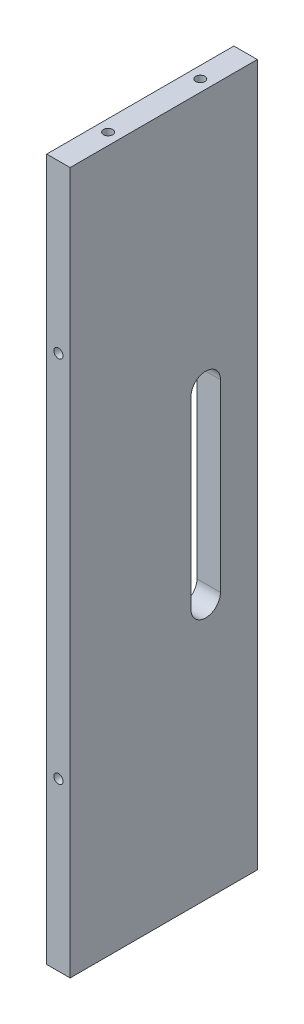
ISO-10303-21;
HEADER;
FILE_DESCRIPTION(('STEP AP214'),'2;1');
FILE_NAME('part.step','',(''),(''),'','','');
FILE_SCHEMA(('AUTOMOTIVE_DESIGN { 1 0 10303 214 1 1 1 1 }'));
ENDSEC;
DATA;
#1=APPLICATION_CONTEXT('core data for automotive mechanical design processes');
#2=APPLICATION_PROTOCOL_DEFINITION('international standard','automotive_design',2000,#1);
#3=PRODUCT_CONTEXT('',#1,'mechanical');
#4=PRODUCT('Part','Part','',(#3));
#5=PRODUCT_RELATED_PRODUCT_CATEGORY('part','',(#4));
#6=PRODUCT_DEFINITION_FORMATION('','',#4);
#7=PRODUCT_DEFINITION_CONTEXT('part definition',#1,'design');
#8=PRODUCT_DEFINITION('design','',#6,#7);
#9=PRODUCT_DEFINITION_SHAPE('','',#8);
#10=(LENGTH_UNIT() NAMED_UNIT(*) SI_UNIT(.MILLI.,.METRE.));
#11=(NAMED_UNIT(*) PLANE_ANGLE_UNIT() SI_UNIT($,.RADIAN.));
#12=(NAMED_UNIT(*) SI_UNIT($,.STERADIAN.) SOLID_ANGLE_UNIT());
#13=UNCERTAINTY_MEASURE_WITH_UNIT(LENGTH_MEASURE(1.E-05),#10,'distance_accuracy_value','');
#14=(GEOMETRIC_REPRESENTATION_CONTEXT(3) GLOBAL_UNCERTAINTY_ASSIGNED_CONTEXT((#13)) GLOBAL_UNIT_ASSIGNED_CONTEXT((#10,
#11,#12)) REPRESENTATION_CONTEXT('',''));
#15=CARTESIAN_POINT('',(0.,0.,0.));
#16=DIRECTION('',(0.,0.,1.));
#17=DIRECTION('',(1.,0.,0.));
#18=AXIS2_PLACEMENT_3D('',#15,#16,#17);
#19=CARTESIAN_POINT('',(-133.35,0.,0.));
#20=DIRECTION('',(1.,0.,0.));
#21=DIRECTION('',(0.,0.,-1.));
#22=AXIS2_PLACEMENT_3D('',#19,#20,#21);
#23=PLANE('',#22);
#24=DIRECTION('',(0.,1.,0.));
#25=VECTOR('',#24,1.);
#26=CARTESIAN_POINT('',(-133.35,-95.25,12.7));
#27=LINE('',#26,#25);
#28=CARTESIAN_POINT('',(-133.35,-95.25,12.7));
#29=VERTEX_POINT('',#28);
#30=CARTESIAN_POINT('',(-133.35,95.25,12.7));
#31=VERTEX_POINT('',#30);
#32=EDGE_CURVE('E222',#29,#31,#27,.T.);
#33=ORIENTED_EDGE('',*,*,#32,.T.);
#34=DIRECTION('',(0.,0.,1.));
#35=VECTOR('',#34,1.);
#36=CARTESIAN_POINT('',(-133.35,95.25,12.7));
#37=LINE('',#36,#35);
#38=CARTESIAN_POINT('',(-133.35,95.25,63.5));
#39=VERTEX_POINT('',#38);
#40=EDGE_CURVE('E227',#31,#39,#37,.T.);
#41=ORIENTED_EDGE('',*,*,#40,.T.);
#42=DIRECTION('',(0.,-1.,0.));
#43=VECTOR('',#42,1.);
#44=CARTESIAN_POINT('',(-133.35,-95.25,63.5));
#45=LINE('',#44,#43);
#46=CARTESIAN_POINT('',(-133.35,-95.25,63.5));
#47=VERTEX_POINT('',#46);
#48=EDGE_CURVE('E233',#39,#47,#45,.T.);
#49=ORIENTED_EDGE('',*,*,#48,.T.);
#50=DIRECTION('',(0.,0.,-1.));
#51=VECTOR('',#50,1.);
#52=CARTESIAN_POINT('',(-133.35,-95.25,12.7));
#53=LINE('',#52,#51);
#54=EDGE_CURVE('E234',#47,#29,#53,.T.);
#55=ORIENTED_EDGE('',*,*,#54,.T.);
#56=EDGE_LOOP('',(#33,#41,#49,#55));
#57=FACE_BOUND('',#56,.T.);
#58=DIRECTION('',(0.,1.,0.));
#59=VECTOR('',#58,1.);
#60=CARTESIAN_POINT('',(-133.35,25.,22.7));
#61=LINE('',#60,#59);
#62=CARTESIAN_POINT('',(-133.35,-25.,22.7));
#63=VERTEX_POINT('',#62);
#64=CARTESIAN_POINT('',(-133.35,25.,22.7));
#65=VERTEX_POINT('',#64);
#66=EDGE_CURVE('E119',#63,#65,#61,.T.);
#67=ORIENTED_EDGE('',*,*,#66,.F.);
#68=CARTESIAN_POINT('',(-133.35,-25.,26.7));
#69=DIRECTION('',(1.,0.,0.));
#70=DIRECTION('',(0.,0.,1.));
#71=AXIS2_PLACEMENT_3D('',#68,#69,#70);
#72=CIRCLE('',#71,4.);
#73=CARTESIAN_POINT('',(-133.35,-25.,30.7));
#74=VERTEX_POINT('',#73);
#75=EDGE_CURVE('E111',#74,#63,#72,.T.);
#76=ORIENTED_EDGE('',*,*,#75,.F.);
#77=DIRECTION('',(0.,-1.,0.));
#78=VECTOR('',#77,1.);
#79=CARTESIAN_POINT('',(-133.35,-25.,30.7));
#80=LINE('',#79,#78);
#81=CARTESIAN_POINT('',(-133.35,25.,30.7));
#82=VERTEX_POINT('',#81);
#83=EDGE_CURVE('E140',#82,#74,#80,.T.);
#84=ORIENTED_EDGE('',*,*,#83,.F.);
#85=CARTESIAN_POINT('',(-133.35,25.,26.7));
#86=DIRECTION('',(1.,0.,0.));
#87=DIRECTION('',(0.,0.,1.));
#88=AXIS2_PLACEMENT_3D('',#85,#86,#87);
#89=CIRCLE('',#88,4.);
#90=EDGE_CURVE('E132',#65,#82,#89,.T.);
#91=ORIENTED_EDGE('',*,*,#90,.F.);
#92=EDGE_LOOP('',(#67,#76,#84,#91));
#93=FACE_BOUND('',#92,.T.);
#94=ADVANCED_FACE('F44',(#57,#93),#23,.T.);
#95=CARTESIAN_POINT('',(-139.7,0.,0.));
#96=DIRECTION('',(1.,0.,0.));
#97=DIRECTION('',(0.,0.,-1.));
#98=AXIS2_PLACEMENT_3D('',#95,#96,#97);
#99=PLANE('',#98);
#100=DIRECTION('',(0.,1.,0.));
#101=VECTOR('',#100,1.);
#102=CARTESIAN_POINT('',(-139.7,-95.25,12.7));
#103=LINE('',#102,#101);
#104=CARTESIAN_POINT('',(-139.7,-95.25,12.7));
#105=VERTEX_POINT('',#104);
#106=CARTESIAN_POINT('',(-139.7,95.25,12.7));
#107=VERTEX_POINT('',#106);
#108=EDGE_CURVE('E212',#105,#107,#103,.T.);
#109=ORIENTED_EDGE('',*,*,#108,.F.);
#110=DIRECTION('',(0.,0.,-1.));
#111=VECTOR('',#110,1.);
#112=CARTESIAN_POINT('',(-139.7,-95.25,12.7));
#113=LINE('',#112,#111);
#114=CARTESIAN_POINT('',(-139.7,-95.25,63.5));
#115=VERTEX_POINT('',#114);
#116=EDGE_CURVE('E226',#115,#105,#113,.T.);
#117=ORIENTED_EDGE('',*,*,#116,.F.);
#118=DIRECTION('',(0.,-1.,0.));
#119=VECTOR('',#118,1.);
#120=CARTESIAN_POINT('',(-139.7,-95.25,63.5));
#121=LINE('',#120,#119);
#122=CARTESIAN_POINT('',(-139.7,95.25,63.5));
#123=VERTEX_POINT('',#122);
#124=EDGE_CURVE('E242',#123,#115,#121,.T.);
#125=ORIENTED_EDGE('',*,*,#124,.F.);
#126=DIRECTION('',(0.,0.,1.));
#127=VECTOR('',#126,1.);
#128=CARTESIAN_POINT('',(-139.7,95.25,12.7));
#129=LINE('',#128,#127);
#130=EDGE_CURVE('E241',#107,#123,#129,.T.);
#131=ORIENTED_EDGE('',*,*,#130,.F.);
#132=EDGE_LOOP('',(#109,#117,#125,#131));
#133=FACE_BOUND('',#132,.T.);
#134=CARTESIAN_POINT('',(-139.7,-25.,26.7));
#135=DIRECTION('',(1.,0.,0.));
#136=DIRECTION('',(0.,0.,1.));
#137=AXIS2_PLACEMENT_3D('',#134,#135,#136);
#138=CIRCLE('',#137,4.);
#139=CARTESIAN_POINT('',(-139.7,-25.,30.7));
#140=VERTEX_POINT('',#139);
#141=CARTESIAN_POINT('',(-139.7,-25.,22.7));
#142=VERTEX_POINT('',#141);
#143=EDGE_CURVE('E70',#140,#142,#138,.T.);
#144=ORIENTED_EDGE('',*,*,#143,.T.);
#145=DIRECTION('',(0.,1.,0.));
#146=VECTOR('',#145,1.);
#147=CARTESIAN_POINT('',(-139.7,25.,22.7));
#148=LINE('',#147,#146);
#149=CARTESIAN_POINT('',(-139.7,25.,22.7));
#150=VERTEX_POINT('',#149);
#151=EDGE_CURVE('E130',#142,#150,#148,.T.);
#152=ORIENTED_EDGE('',*,*,#151,.T.);
#153=CARTESIAN_POINT('',(-139.7,25.,26.7));
#154=DIRECTION('',(1.,0.,0.));
#155=DIRECTION('',(0.,0.,1.));
#156=AXIS2_PLACEMENT_3D('',#153,#154,#155);
#157=CIRCLE('',#156,4.);
#158=CARTESIAN_POINT('',(-139.7,25.,30.7));
#159=VERTEX_POINT('',#158);
#160=EDGE_CURVE('E147',#150,#159,#157,.T.);
#161=ORIENTED_EDGE('',*,*,#160,.T.);
#162=DIRECTION('',(0.,-1.,0.));
#163=VECTOR('',#162,1.);
#164=CARTESIAN_POINT('',(-139.7,-25.,30.7));
#165=LINE('',#164,#163);
#166=EDGE_CURVE('E122',#159,#140,#165,.T.);
#167=ORIENTED_EDGE('',*,*,#166,.T.);
#168=EDGE_LOOP('',(#144,#152,#161,#167));
#169=FACE_BOUND('',#168,.T.);
#170=ADVANCED_FACE('F270',(#133,#169),#99,.F.);
#171=CARTESIAN_POINT('',(-133.35,-95.25,12.7));
#172=DIRECTION('',(0.,0.,1.));
#173=DIRECTION('',(1.,0.,0.));
#174=AXIS2_PLACEMENT_3D('',#171,#172,#173);
#175=PLANE('',#174);
#176=CARTESIAN_POINT('',(-136.525,-50.,12.7));
#177=DIRECTION('',(0.,0.,1.));
#178=DIRECTION('',(1.,0.,0.));
#179=AXIS2_PLACEMENT_3D('',#176,#177,#178);
#180=CIRCLE('',#179,1.25);
#181=CARTESIAN_POINT('',(-135.275,-50.,12.7));
#182=VERTEX_POINT('',#181);
#183=EDGE_CURVE('E215',#182,#182,#180,.T.);
#184=ORIENTED_EDGE('',*,*,#183,.T.);
#185=EDGE_LOOP('',(#184));
#186=FACE_BOUND('',#185,.T.);
#187=CARTESIAN_POINT('',(-136.525,50.,12.7));
#188=DIRECTION('',(0.,0.,1.));
#189=DIRECTION('',(1.,0.,0.));
#190=AXIS2_PLACEMENT_3D('',#187,#188,#189);
#191=CIRCLE('',#190,1.25);
#192=CARTESIAN_POINT('',(-135.275,50.,12.7));
#193=VERTEX_POINT('',#192);
#194=EDGE_CURVE('E218',#193,#193,#191,.T.);
#195=ORIENTED_EDGE('',*,*,#194,.T.);
#196=EDGE_LOOP('',(#195));
#197=FACE_BOUND('',#196,.T.);
#198=ORIENTED_EDGE('',*,*,#108,.T.);
#199=DIRECTION('',(-1.,0.,0.));
#200=VECTOR('',#199,1.);
#201=CARTESIAN_POINT('',(-133.35,95.25,12.7));
#202=LINE('',#201,#200);
#203=EDGE_CURVE('E11',#31,#107,#202,.T.);
#204=ORIENTED_EDGE('',*,*,#203,.F.);
#205=ORIENTED_EDGE('',*,*,#32,.F.);
#206=DIRECTION('',(-1.,0.,0.));
#207=VECTOR('',#206,1.);
#208=CARTESIAN_POINT('',(-133.35,-95.25,12.7));
#209=LINE('',#208,#207);
#210=EDGE_CURVE('E240',#29,#105,#209,.T.);
#211=ORIENTED_EDGE('',*,*,#210,.T.);
#212=EDGE_LOOP('',(#198,#204,#205,#211));
#213=FACE_BOUND('',#212,.T.);
#214=ADVANCED_FACE('F50',(#186,#197,#213),#175,.F.);
#215=CARTESIAN_POINT('',(-133.35,95.25,12.7));
#216=DIRECTION('',(0.,-1.,0.));
#217=DIRECTION('',(0.,0.,-1.));
#218=AXIS2_PLACEMENT_3D('',#215,#216,#217);
#219=PLANE('',#218);
#220=CARTESIAN_POINT('',(-136.525,95.25,25.));
#221=DIRECTION('',(0.,1.,0.));
#222=DIRECTION('',(0.,0.,1.));
#223=AXIS2_PLACEMENT_3D('',#220,#221,#222);
#224=CIRCLE('',#223,1.25);
#225=CARTESIAN_POINT('',(-136.525,95.25,26.25));
#226=VERTEX_POINT('',#225);
#227=EDGE_CURVE('E174',#226,#226,#224,.T.);
#228=ORIENTED_EDGE('',*,*,#227,.F.);
#229=EDGE_LOOP('',(#228));
#230=FACE_BOUND('',#229,.T.);
#231=CARTESIAN_POINT('',(-136.525,95.25,50.));
#232=DIRECTION('',(0.,1.,0.));
#233=DIRECTION('',(0.,0.,1.));
#234=AXIS2_PLACEMENT_3D('',#231,#232,#233);
#235=CIRCLE('',#234,1.25);
#236=CARTESIAN_POINT('',(-136.525,95.25,51.25));
#237=VERTEX_POINT('',#236);
#238=EDGE_CURVE('E161',#237,#237,#235,.T.);
#239=ORIENTED_EDGE('',*,*,#238,.F.);
#240=EDGE_LOOP('',(#239));
#241=FACE_BOUND('',#240,.T.);
#242=ORIENTED_EDGE('',*,*,#130,.T.);
#243=DIRECTION('',(-1.,0.,0.));
#244=VECTOR('',#243,1.);
#245=CARTESIAN_POINT('',(-133.35,95.25,63.5));
#246=LINE('',#245,#244);
#247=EDGE_CURVE('E53',#39,#123,#246,.T.);
#248=ORIENTED_EDGE('',*,*,#247,.F.);
#249=ORIENTED_EDGE('',*,*,#40,.F.);
#250=ORIENTED_EDGE('',*,*,#203,.T.);
#251=EDGE_LOOP('',(#242,#248,#249,#250));
#252=FACE_BOUND('',#251,.T.);
#253=ADVANCED_FACE('F280',(#230,#241,#252),#219,.F.);
#254=CARTESIAN_POINT('',(-133.35,-95.25,63.5));
#255=DIRECTION('',(0.,0.,-1.));
#256=DIRECTION('',(-1.,0.,0.));
#257=AXIS2_PLACEMENT_3D('',#254,#255,#256);
#258=PLANE('',#257);
#259=CARTESIAN_POINT('',(-136.525,-50.,63.5));
#260=DIRECTION('',(0.,0.,1.));
#261=DIRECTION('',(1.,0.,0.));
#262=AXIS2_PLACEMENT_3D('',#259,#260,#261);
#263=CIRCLE('',#262,1.25);
#264=CARTESIAN_POINT('',(-135.275,-50.,63.5));
#265=VERTEX_POINT('',#264);
#266=EDGE_CURVE('E192',#265,#265,#263,.T.);
#267=ORIENTED_EDGE('',*,*,#266,.F.);
#268=EDGE_LOOP('',(#267));
#269=FACE_BOUND('',#268,.T.);
#270=CARTESIAN_POINT('',(-136.525,50.,63.5));
#271=DIRECTION('',(0.,0.,1.));
#272=DIRECTION('',(1.,0.,0.));
#273=AXIS2_PLACEMENT_3D('',#270,#271,#272);
#274=CIRCLE('',#273,1.25);
#275=CARTESIAN_POINT('',(-135.275,50.,63.5));
#276=VERTEX_POINT('',#275);
#277=EDGE_CURVE('E177',#276,#276,#274,.T.);
#278=ORIENTED_EDGE('',*,*,#277,.F.);
#279=EDGE_LOOP('',(#278));
#280=FACE_BOUND('',#279,.T.);
#281=ORIENTED_EDGE('',*,*,#124,.T.);
#282=DIRECTION('',(-1.,0.,0.));
#283=VECTOR('',#282,1.);
#284=CARTESIAN_POINT('',(-133.35,-95.25,63.5));
#285=LINE('',#284,#283);
#286=EDGE_CURVE('E255',#47,#115,#285,.T.);
#287=ORIENTED_EDGE('',*,*,#286,.F.);
#288=ORIENTED_EDGE('',*,*,#48,.F.);
#289=ORIENTED_EDGE('',*,*,#247,.T.);
#290=EDGE_LOOP('',(#281,#287,#288,#289));
#291=FACE_BOUND('',#290,.T.);
#292=ADVANCED_FACE('F263',(#269,#280,#291),#258,.F.);
#293=CARTESIAN_POINT('',(-133.35,-95.25,12.7));
#294=DIRECTION('',(0.,1.,0.));
#295=DIRECTION('',(0.,0.,1.));
#296=AXIS2_PLACEMENT_3D('',#293,#294,#295);
#297=PLANE('',#296);
#298=CARTESIAN_POINT('',(-136.525,-95.25,25.));
#299=DIRECTION('',(0.,1.,0.));
#300=DIRECTION('',(0.,0.,1.));
#301=AXIS2_PLACEMENT_3D('',#298,#299,#300);
#302=CIRCLE('',#301,1.25);
#303=CARTESIAN_POINT('',(-136.525,-95.25,26.25));
#304=VERTEX_POINT('',#303);
#305=EDGE_CURVE('E165',#304,#304,#302,.T.);
#306=ORIENTED_EDGE('',*,*,#305,.T.);
#307=EDGE_LOOP('',(#306));
#308=FACE_BOUND('',#307,.T.);
#309=CARTESIAN_POINT('',(-136.525,-95.25,50.));
#310=DIRECTION('',(0.,1.,0.));
#311=DIRECTION('',(0.,0.,1.));
#312=AXIS2_PLACEMENT_3D('',#309,#310,#311);
#313=CIRCLE('',#312,1.25);
#314=CARTESIAN_POINT('',(-136.525,-95.25,51.25));
#315=VERTEX_POINT('',#314);
#316=EDGE_CURVE('E166',#315,#315,#313,.T.);
#317=ORIENTED_EDGE('',*,*,#316,.T.);
#318=EDGE_LOOP('',(#317));
#319=FACE_BOUND('',#318,.T.);
#320=ORIENTED_EDGE('',*,*,#116,.T.);
#321=ORIENTED_EDGE('',*,*,#210,.F.);
#322=ORIENTED_EDGE('',*,*,#54,.F.);
#323=ORIENTED_EDGE('',*,*,#286,.T.);
#324=EDGE_LOOP('',(#320,#321,#322,#323));
#325=FACE_BOUND('',#324,.T.);
#326=ADVANCED_FACE('F272',(#308,#319,#325),#297,.F.);
#327=CARTESIAN_POINT('',(-136.525,50.,22.7));
#328=DIRECTION('',(0.,0.,-1.));
#329=DIRECTION('',(-1.,0.,0.));
#330=AXIS2_PLACEMENT_3D('',#327,#328,#329);
#331=CYLINDRICAL_SURFACE('',#330,1.25);
#332=CARTESIAN_POINT('',(-136.525,50.,22.7));
#333=DIRECTION('',(0.,0.,1.));
#334=DIRECTION('',(1.,0.,0.));
#335=AXIS2_PLACEMENT_3D('',#332,#333,#334);
#336=CIRCLE('',#335,1.25);
#337=CARTESIAN_POINT('',(-135.275,50.,22.7));
#338=VERTEX_POINT('',#337);
#339=EDGE_CURVE('E193',#338,#338,#336,.T.);
#340=ORIENTED_EDGE('',*,*,#339,.T.);
#341=EDGE_LOOP('',(#340));
#342=FACE_BOUND('',#341,.T.);
#343=ORIENTED_EDGE('',*,*,#194,.F.);
#344=EDGE_LOOP('',(#343));
#345=FACE_BOUND('',#344,.T.);
#346=ADVANCED_FACE('F303',(#342,#345),#331,.F.);
#347=CARTESIAN_POINT('',(-136.525,50.,22.7));
#348=DIRECTION('',(0.,0.,1.));
#349=DIRECTION('',(1.,0.,0.));
#350=AXIS2_PLACEMENT_3D('',#347,#348,#349);
#351=PLANE('',#350);
#352=ORIENTED_EDGE('',*,*,#339,.F.);
#353=EDGE_LOOP('',(#352));
#354=FACE_BOUND('',#353,.T.);
#355=ADVANCED_FACE('F299',(#354),#351,.F.);
#356=CARTESIAN_POINT('',(-136.525,-50.,22.7));
#357=DIRECTION('',(0.,0.,-1.));
#358=DIRECTION('',(-1.,0.,0.));
#359=AXIS2_PLACEMENT_3D('',#356,#357,#358);
#360=CYLINDRICAL_SURFACE('',#359,1.25);
#361=CARTESIAN_POINT('',(-136.525,-50.,22.7));
#362=DIRECTION('',(0.,0.,1.));
#363=DIRECTION('',(1.,0.,0.));
#364=AXIS2_PLACEMENT_3D('',#361,#362,#363);
#365=CIRCLE('',#364,1.25);
#366=CARTESIAN_POINT('',(-135.275,-50.,22.7));
#367=VERTEX_POINT('',#366);
#368=EDGE_CURVE('E210',#367,#367,#365,.T.);
#369=ORIENTED_EDGE('',*,*,#368,.T.);
#370=EDGE_LOOP('',(#369));
#371=FACE_BOUND('',#370,.T.);
#372=ORIENTED_EDGE('',*,*,#183,.F.);
#373=EDGE_LOOP('',(#372));
#374=FACE_BOUND('',#373,.T.);
#375=ADVANCED_FACE('F359',(#371,#374),#360,.F.);
#376=CARTESIAN_POINT('',(-136.525,-50.,22.7));
#377=DIRECTION('',(0.,0.,1.));
#378=DIRECTION('',(1.,0.,0.));
#379=AXIS2_PLACEMENT_3D('',#376,#377,#378);
#380=PLANE('',#379);
#381=ORIENTED_EDGE('',*,*,#368,.F.);
#382=EDGE_LOOP('',(#381));
#383=FACE_BOUND('',#382,.T.);
#384=ADVANCED_FACE('F352',(#383),#380,.F.);
#385=CARTESIAN_POINT('',(-136.525,50.,63.5));
#386=DIRECTION('',(0.,0.,-1.));
#387=DIRECTION('',(-1.,0.,0.));
#388=AXIS2_PLACEMENT_3D('',#385,#386,#387);
#389=CYLINDRICAL_SURFACE('',#388,1.25);
#390=ORIENTED_EDGE('',*,*,#277,.T.);
#391=EDGE_LOOP('',(#390));
#392=FACE_BOUND('',#391,.T.);
#393=CARTESIAN_POINT('',(-136.525,50.,53.5));
#394=DIRECTION('',(0.,0.,1.));
#395=DIRECTION('',(1.,0.,0.));
#396=AXIS2_PLACEMENT_3D('',#393,#394,#395);
#397=CIRCLE('',#396,1.25);
#398=CARTESIAN_POINT('',(-135.275,50.,53.5));
#399=VERTEX_POINT('',#398);
#400=EDGE_CURVE('E196',#399,#399,#397,.T.);
#401=ORIENTED_EDGE('',*,*,#400,.F.);
#402=EDGE_LOOP('',(#401));
#403=FACE_BOUND('',#402,.T.);
#404=ADVANCED_FACE('F346',(#392,#403),#389,.F.);
#405=CARTESIAN_POINT('',(-136.525,50.,53.5));
#406=DIRECTION('',(0.,0.,1.));
#407=DIRECTION('',(1.,0.,0.));
#408=AXIS2_PLACEMENT_3D('',#405,#406,#407);
#409=PLANE('',#408);
#410=ORIENTED_EDGE('',*,*,#400,.T.);
#411=EDGE_LOOP('',(#410));
#412=FACE_BOUND('',#411,.T.);
#413=ADVANCED_FACE('F347',(#412),#409,.T.);
#414=CARTESIAN_POINT('',(-136.525,-50.,63.5));
#415=DIRECTION('',(0.,0.,-1.));
#416=DIRECTION('',(-1.,0.,0.));
#417=AXIS2_PLACEMENT_3D('',#414,#415,#416);
#418=CYLINDRICAL_SURFACE('',#417,1.25);
#419=ORIENTED_EDGE('',*,*,#266,.T.);
#420=EDGE_LOOP('',(#419));
#421=FACE_BOUND('',#420,.T.);
#422=CARTESIAN_POINT('',(-136.525,-50.,53.5));
#423=DIRECTION('',(0.,0.,1.));
#424=DIRECTION('',(1.,0.,0.));
#425=AXIS2_PLACEMENT_3D('',#422,#423,#424);
#426=CIRCLE('',#425,1.25);
#427=CARTESIAN_POINT('',(-135.275,-50.,53.5));
#428=VERTEX_POINT('',#427);
#429=EDGE_CURVE('E198',#428,#428,#426,.T.);
#430=ORIENTED_EDGE('',*,*,#429,.F.);
#431=EDGE_LOOP('',(#430));
#432=FACE_BOUND('',#431,.T.);
#433=ADVANCED_FACE('F341',(#421,#432),#418,.F.);
#434=CARTESIAN_POINT('',(-136.525,-50.,53.5));
#435=DIRECTION('',(0.,0.,1.));
#436=DIRECTION('',(1.,0.,0.));
#437=AXIS2_PLACEMENT_3D('',#434,#435,#436);
#438=PLANE('',#437);
#439=ORIENTED_EDGE('',*,*,#429,.T.);
#440=EDGE_LOOP('',(#439));
#441=FACE_BOUND('',#440,.T.);
#442=ADVANCED_FACE('F336',(#441),#438,.T.);
#443=CARTESIAN_POINT('',(-136.525,95.25,50.));
#444=DIRECTION('',(0.,-1.,0.));
#445=DIRECTION('',(0.,0.,-1.));
#446=AXIS2_PLACEMENT_3D('',#443,#444,#445);
#447=CYLINDRICAL_SURFACE('',#446,1.25);
#448=ORIENTED_EDGE('',*,*,#238,.T.);
#449=EDGE_LOOP('',(#448));
#450=FACE_BOUND('',#449,.T.);
#451=CARTESIAN_POINT('',(-136.525,85.25,50.));
#452=DIRECTION('',(0.,1.,0.));
#453=DIRECTION('',(0.,0.,1.));
#454=AXIS2_PLACEMENT_3D('',#451,#452,#453);
#455=CIRCLE('',#454,1.25);
#456=CARTESIAN_POINT('',(-136.525,85.25,51.25));
#457=VERTEX_POINT('',#456);
#458=EDGE_CURVE('E183',#457,#457,#455,.T.);
#459=ORIENTED_EDGE('',*,*,#458,.F.);
#460=EDGE_LOOP('',(#459));
#461=FACE_BOUND('',#460,.T.);
#462=ADVANCED_FACE('F337',(#450,#461),#447,.F.);
#463=CARTESIAN_POINT('',(-136.525,85.25,50.));
#464=DIRECTION('',(0.,1.,0.));
#465=DIRECTION('',(0.,0.,1.));
#466=AXIS2_PLACEMENT_3D('',#463,#464,#465);
#467=PLANE('',#466);
#468=ORIENTED_EDGE('',*,*,#458,.T.);
#469=EDGE_LOOP('',(#468));
#470=FACE_BOUND('',#469,.T.);
#471=ADVANCED_FACE('F333',(#470),#467,.T.);
#472=CARTESIAN_POINT('',(-136.525,95.25,25.));
#473=DIRECTION('',(0.,-1.,0.));
#474=DIRECTION('',(0.,0.,-1.));
#475=AXIS2_PLACEMENT_3D('',#472,#473,#474);
#476=CYLINDRICAL_SURFACE('',#475,1.25);
#477=ORIENTED_EDGE('',*,*,#227,.T.);
#478=EDGE_LOOP('',(#477));
#479=FACE_BOUND('',#478,.T.);
#480=CARTESIAN_POINT('',(-136.525,85.25,25.));
#481=DIRECTION('',(0.,1.,0.));
#482=DIRECTION('',(0.,0.,1.));
#483=AXIS2_PLACEMENT_3D('',#480,#481,#482);
#484=CIRCLE('',#483,1.25);
#485=CARTESIAN_POINT('',(-136.525,85.25,26.25));
#486=VERTEX_POINT('',#485);
#487=EDGE_CURVE('E179',#486,#486,#484,.T.);
#488=ORIENTED_EDGE('',*,*,#487,.F.);
#489=EDGE_LOOP('',(#488));
#490=FACE_BOUND('',#489,.T.);
#491=ADVANCED_FACE('F328',(#479,#490),#476,.F.);
#492=CARTESIAN_POINT('',(-136.525,85.25,25.));
#493=DIRECTION('',(0.,1.,0.));
#494=DIRECTION('',(0.,0.,1.));
#495=AXIS2_PLACEMENT_3D('',#492,#493,#494);
#496=PLANE('',#495);
#497=ORIENTED_EDGE('',*,*,#487,.T.);
#498=EDGE_LOOP('',(#497));
#499=FACE_BOUND('',#498,.T.);
#500=ADVANCED_FACE('F320',(#499),#496,.T.);
#501=CARTESIAN_POINT('',(-136.525,-85.25,50.));
#502=DIRECTION('',(0.,-1.,0.));
#503=DIRECTION('',(0.,0.,-1.));
#504=AXIS2_PLACEMENT_3D('',#501,#502,#503);
#505=CYLINDRICAL_SURFACE('',#504,1.25);
#506=CARTESIAN_POINT('',(-136.525,-85.25,50.));
#507=DIRECTION('',(0.,1.,0.));
#508=DIRECTION('',(0.,0.,1.));
#509=AXIS2_PLACEMENT_3D('',#506,#507,#508);
#510=CIRCLE('',#509,1.25);
#511=CARTESIAN_POINT('',(-136.525,-85.25,51.25));
#512=VERTEX_POINT('',#511);
#513=EDGE_CURVE('E126',#512,#512,#510,.T.);
#514=ORIENTED_EDGE('',*,*,#513,.T.);
#515=EDGE_LOOP('',(#514));
#516=FACE_BOUND('',#515,.T.);
#517=ORIENTED_EDGE('',*,*,#316,.F.);
#518=EDGE_LOOP('',(#517));
#519=FACE_BOUND('',#518,.T.);
#520=ADVANCED_FACE('F314',(#516,#519),#505,.F.);
#521=CARTESIAN_POINT('',(-136.525,-85.25,50.));
#522=DIRECTION('',(0.,1.,0.));
#523=DIRECTION('',(0.,0.,1.));
#524=AXIS2_PLACEMENT_3D('',#521,#522,#523);
#525=PLANE('',#524);
#526=ORIENTED_EDGE('',*,*,#513,.F.);
#527=EDGE_LOOP('',(#526));
#528=FACE_BOUND('',#527,.T.);
#529=ADVANCED_FACE('F317',(#528),#525,.F.);
#530=CARTESIAN_POINT('',(-136.525,-85.25,25.));
#531=DIRECTION('',(0.,-1.,0.));
#532=DIRECTION('',(0.,0.,-1.));
#533=AXIS2_PLACEMENT_3D('',#530,#531,#532);
#534=CYLINDRICAL_SURFACE('',#533,1.25);
#535=CARTESIAN_POINT('',(-136.525,-85.25,25.));
#536=DIRECTION('',(0.,1.,0.));
#537=DIRECTION('',(0.,0.,1.));
#538=AXIS2_PLACEMENT_3D('',#535,#536,#537);
#539=CIRCLE('',#538,1.25);
#540=CARTESIAN_POINT('',(-136.525,-85.25,26.25));
#541=VERTEX_POINT('',#540);
#542=EDGE_CURVE('E158',#541,#541,#539,.T.);
#543=ORIENTED_EDGE('',*,*,#542,.T.);
#544=EDGE_LOOP('',(#543));
#545=FACE_BOUND('',#544,.T.);
#546=ORIENTED_EDGE('',*,*,#305,.F.);
#547=EDGE_LOOP('',(#546));
#548=FACE_BOUND('',#547,.T.);
#549=ADVANCED_FACE('F324',(#545,#548),#534,.F.);
#550=CARTESIAN_POINT('',(-136.525,-85.25,25.));
#551=DIRECTION('',(0.,1.,0.));
#552=DIRECTION('',(0.,0.,1.));
#553=AXIS2_PLACEMENT_3D('',#550,#551,#552);
#554=PLANE('',#553);
#555=ORIENTED_EDGE('',*,*,#542,.F.);
#556=EDGE_LOOP('',(#555));
#557=FACE_BOUND('',#556,.T.);
#558=ADVANCED_FACE('F468',(#557),#554,.F.);
#559=CARTESIAN_POINT('',(-133.35,-25.,26.7));
#560=DIRECTION('',(-1.,0.,0.));
#561=DIRECTION('',(0.,0.,1.));
#562=AXIS2_PLACEMENT_3D('',#559,#560,#561);
#563=CYLINDRICAL_SURFACE('',#562,4.);
#564=ORIENTED_EDGE('',*,*,#143,.F.);
#565=DIRECTION('',(-1.,0.,0.));
#566=VECTOR('',#565,1.);
#567=CARTESIAN_POINT('',(-133.35,-25.,30.7));
#568=LINE('',#567,#566);
#569=EDGE_CURVE('E114',#74,#140,#568,.T.);
#570=ORIENTED_EDGE('',*,*,#569,.F.);
#571=ORIENTED_EDGE('',*,*,#75,.T.);
#572=DIRECTION('',(-1.,0.,0.));
#573=VECTOR('',#572,1.);
#574=CARTESIAN_POINT('',(-133.35,-25.,22.7));
#575=LINE('',#574,#573);
#576=EDGE_CURVE('E112',#63,#142,#575,.T.);
#577=ORIENTED_EDGE('',*,*,#576,.T.);
#578=EDGE_LOOP('',(#564,#570,#571,#577));
#579=FACE_BOUND('',#578,.T.);
#580=ADVANCED_FACE('F113',(#579),#563,.F.);
#581=CARTESIAN_POINT('',(-133.35,25.,22.7));
#582=DIRECTION('',(0.,0.,1.));
#583=DIRECTION('',(1.,0.,0.));
#584=AXIS2_PLACEMENT_3D('',#581,#582,#583);
#585=PLANE('',#584);
#586=ORIENTED_EDGE('',*,*,#151,.F.);
#587=ORIENTED_EDGE('',*,*,#576,.F.);
#588=ORIENTED_EDGE('',*,*,#66,.T.);
#589=DIRECTION('',(-1.,0.,0.));
#590=VECTOR('',#589,1.);
#591=CARTESIAN_POINT('',(-133.35,25.,22.7));
#592=LINE('',#591,#590);
#593=EDGE_CURVE('E128',#65,#150,#592,.T.);
#594=ORIENTED_EDGE('',*,*,#593,.T.);
#595=EDGE_LOOP('',(#586,#587,#588,#594));
#596=FACE_BOUND('',#595,.T.);
#597=ADVANCED_FACE('F121',(#596),#585,.T.);
#598=CARTESIAN_POINT('',(-133.35,25.,26.7));
#599=DIRECTION('',(-1.,0.,0.));
#600=DIRECTION('',(0.,0.,1.));
#601=AXIS2_PLACEMENT_3D('',#598,#599,#600);
#602=CYLINDRICAL_SURFACE('',#601,4.);
#603=ORIENTED_EDGE('',*,*,#160,.F.);
#604=ORIENTED_EDGE('',*,*,#593,.F.);
#605=ORIENTED_EDGE('',*,*,#90,.T.);
#606=DIRECTION('',(-1.,0.,0.));
#607=VECTOR('',#606,1.);
#608=CARTESIAN_POINT('',(-133.35,25.,30.7));
#609=LINE('',#608,#607);
#610=EDGE_CURVE('E62',#82,#159,#609,.T.);
#611=ORIENTED_EDGE('',*,*,#610,.T.);
#612=EDGE_LOOP('',(#603,#604,#605,#611));
#613=FACE_BOUND('',#612,.T.);
#614=ADVANCED_FACE('F501',(#613),#602,.F.);
#615=CARTESIAN_POINT('',(-133.35,-25.,30.7));
#616=DIRECTION('',(0.,0.,-1.));
#617=DIRECTION('',(-1.,0.,0.));
#618=AXIS2_PLACEMENT_3D('',#615,#616,#617);
#619=PLANE('',#618);
#620=ORIENTED_EDGE('',*,*,#166,.F.);
#621=ORIENTED_EDGE('',*,*,#610,.F.);
#622=ORIENTED_EDGE('',*,*,#83,.T.);
#623=ORIENTED_EDGE('',*,*,#569,.T.);
#624=EDGE_LOOP('',(#620,#621,#622,#623));
#625=FACE_BOUND('',#624,.T.);
#626=ADVANCED_FACE('F508',(#625),#619,.T.);
#627=CLOSED_SHELL('',(#94,#170,#214,#253,#292,#326,#346,#355,#375,#384,#404,#413,#433,#442,#462,
#471,#491,#500,#520,#529,#549,#558,#580,#597,#614,#626));
#628=MANIFOLD_SOLID_BREP('B2',#627);
#629=ADVANCED_BREP_SHAPE_REPRESENTATION('',(#18,#628),#14);
#630=SHAPE_DEFINITION_REPRESENTATION(#9,#629);
ENDSEC;
END-ISO-10303-21;
